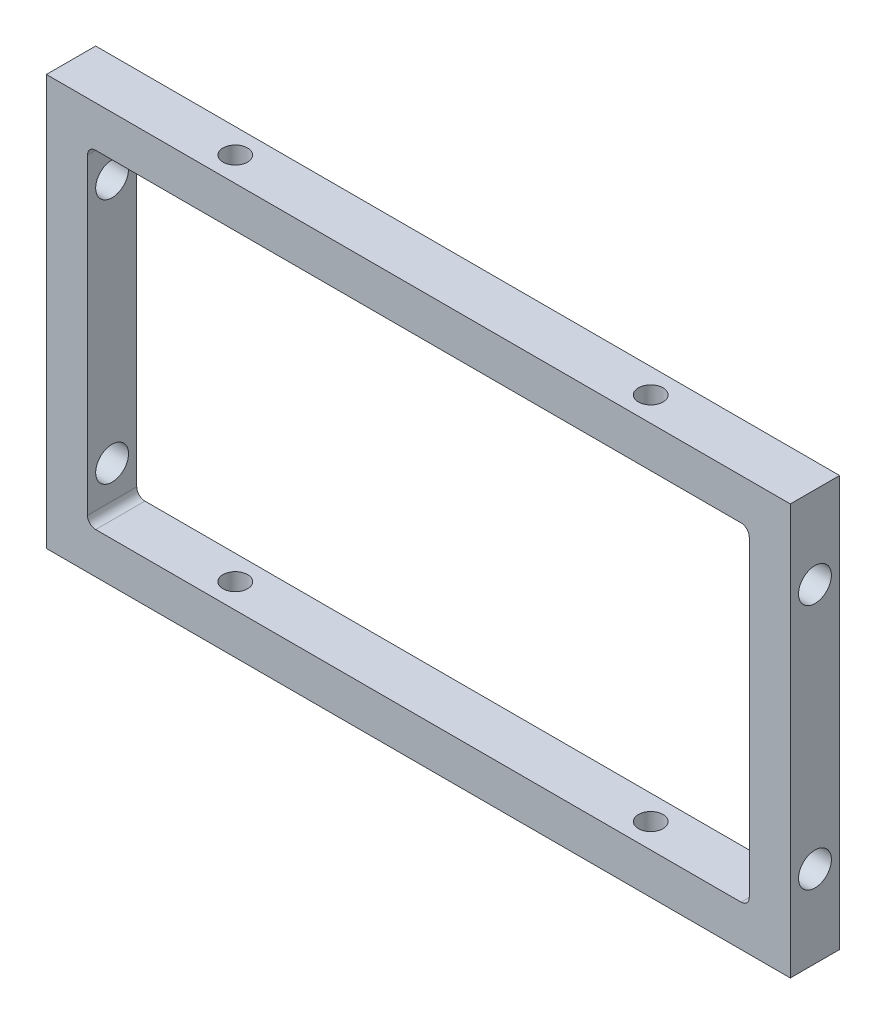
ISO-10303-21;
HEADER;
FILE_DESCRIPTION(('STEP AP214'),'2;1');
FILE_NAME('part.step','',(''),(''),'','','');
FILE_SCHEMA(('AUTOMOTIVE_DESIGN { 1 0 10303 214 1 1 1 1 }'));
ENDSEC;
DATA;
#1=APPLICATION_CONTEXT('core data for automotive mechanical design processes');
#2=APPLICATION_PROTOCOL_DEFINITION('international standard','automotive_design',2000,#1);
#3=PRODUCT_CONTEXT('',#1,'mechanical');
#4=PRODUCT('Part','Part','',(#3));
#5=PRODUCT_RELATED_PRODUCT_CATEGORY('part','',(#4));
#6=PRODUCT_DEFINITION_FORMATION('','',#4);
#7=PRODUCT_DEFINITION_CONTEXT('part definition',#1,'design');
#8=PRODUCT_DEFINITION('design','',#6,#7);
#9=PRODUCT_DEFINITION_SHAPE('','',#8);
#10=(LENGTH_UNIT() NAMED_UNIT(*) SI_UNIT(.MILLI.,.METRE.));
#11=(NAMED_UNIT(*) PLANE_ANGLE_UNIT() SI_UNIT($,.RADIAN.));
#12=(NAMED_UNIT(*) SI_UNIT($,.STERADIAN.) SOLID_ANGLE_UNIT());
#13=UNCERTAINTY_MEASURE_WITH_UNIT(LENGTH_MEASURE(1.E-05),#10,'distance_accuracy_value','');
#14=(GEOMETRIC_REPRESENTATION_CONTEXT(3) GLOBAL_UNCERTAINTY_ASSIGNED_CONTEXT((#13)) GLOBAL_UNIT_ASSIGNED_CONTEXT((#10,
#11,#12)) REPRESENTATION_CONTEXT('',''));
#15=CARTESIAN_POINT('',(0.,0.,0.));
#16=DIRECTION('',(0.,0.,1.));
#17=DIRECTION('',(1.,0.,0.));
#18=AXIS2_PLACEMENT_3D('',#15,#16,#17);
#19=CARTESIAN_POINT('',(0.,0.,6.));
#20=DIRECTION('',(0.,0.,1.));
#21=DIRECTION('',(1.,0.,0.));
#22=AXIS2_PLACEMENT_3D('',#19,#20,#21);
#23=PLANE('',#22);
#24=DIRECTION('',(0.,1.,0.));
#25=VECTOR('',#24,1.);
#26=CARTESIAN_POINT('',(45.3,25.,6.));
#27=LINE('',#26,#25);
#28=CARTESIAN_POINT('',(45.3,-25.,6.));
#29=VERTEX_POINT('',#28);
#30=CARTESIAN_POINT('',(45.3,25.,6.));
#31=VERTEX_POINT('',#30);
#32=EDGE_CURVE('E137',#29,#31,#27,.T.);
#33=ORIENTED_EDGE('',*,*,#32,.T.);
#34=DIRECTION('',(-1.,0.,0.));
#35=VECTOR('',#34,1.);
#36=CARTESIAN_POINT('',(-45.3,25.,6.));
#37=LINE('',#36,#35);
#38=CARTESIAN_POINT('',(-45.3,25.,6.));
#39=VERTEX_POINT('',#38);
#40=EDGE_CURVE('E126',#31,#39,#37,.T.);
#41=ORIENTED_EDGE('',*,*,#40,.T.);
#42=DIRECTION('',(0.,-1.,0.));
#43=VECTOR('',#42,1.);
#44=CARTESIAN_POINT('',(-45.3,25.,6.));
#45=LINE('',#44,#43);
#46=CARTESIAN_POINT('',(-45.3,-25.,6.));
#47=VERTEX_POINT('',#46);
#48=EDGE_CURVE('E136',#39,#47,#45,.T.);
#49=ORIENTED_EDGE('',*,*,#48,.T.);
#50=DIRECTION('',(1.,0.,0.));
#51=VECTOR('',#50,1.);
#52=CARTESIAN_POINT('',(-45.3,-25.,6.));
#53=LINE('',#52,#51);
#54=EDGE_CURVE('E141',#47,#29,#53,.T.);
#55=ORIENTED_EDGE('',*,*,#54,.T.);
#56=EDGE_LOOP('',(#33,#41,#49,#55));
#57=FACE_BOUND('',#56,.T.);
#58=DIRECTION('',(-1.,0.,0.));
#59=VECTOR('',#58,1.);
#60=CARTESIAN_POINT('',(-40.3,20.,6.));
#61=LINE('',#60,#59);
#62=CARTESIAN_POINT('',(39.3,20.,6.));
#63=VERTEX_POINT('',#62);
#64=CARTESIAN_POINT('',(-39.3,20.,6.));
#65=VERTEX_POINT('',#64);
#66=EDGE_CURVE('E237',#63,#65,#61,.T.);
#67=ORIENTED_EDGE('',*,*,#66,.F.);
#68=CARTESIAN_POINT('',(39.3,19.,6.));
#69=DIRECTION('',(0.,0.,1.));
#70=DIRECTION('',(1.,0.,0.));
#71=AXIS2_PLACEMENT_3D('',#68,#69,#70);
#72=CIRCLE('',#71,1.);
#73=CARTESIAN_POINT('',(40.3,19.,6.));
#74=VERTEX_POINT('',#73);
#75=EDGE_CURVE('E51',#63,#74,#72,.F.);
#76=ORIENTED_EDGE('',*,*,#75,.T.);
#77=DIRECTION('',(0.,1.,0.));
#78=VECTOR('',#77,1.);
#79=CARTESIAN_POINT('',(40.3,20.,6.));
#80=LINE('',#79,#78);
#81=CARTESIAN_POINT('',(40.3,-19.,6.));
#82=VERTEX_POINT('',#81);
#83=EDGE_CURVE('E235',#82,#74,#80,.T.);
#84=ORIENTED_EDGE('',*,*,#83,.F.);
#85=CARTESIAN_POINT('',(39.3,-19.,6.));
#86=DIRECTION('',(0.,0.,1.));
#87=DIRECTION('',(1.,0.,0.));
#88=AXIS2_PLACEMENT_3D('',#85,#86,#87);
#89=CIRCLE('',#88,1.);
#90=CARTESIAN_POINT('',(39.3,-20.,6.));
#91=VERTEX_POINT('',#90);
#92=EDGE_CURVE('E11',#82,#91,#89,.F.);
#93=ORIENTED_EDGE('',*,*,#92,.T.);
#94=DIRECTION('',(1.,0.,0.));
#95=VECTOR('',#94,1.);
#96=CARTESIAN_POINT('',(-40.3,-20.,6.));
#97=LINE('',#96,#95);
#98=CARTESIAN_POINT('',(-39.3,-20.,6.));
#99=VERTEX_POINT('',#98);
#100=EDGE_CURVE('E244',#99,#91,#97,.T.);
#101=ORIENTED_EDGE('',*,*,#100,.F.);
#102=CARTESIAN_POINT('',(-39.3,-19.,6.));
#103=DIRECTION('',(0.,0.,1.));
#104=DIRECTION('',(1.,0.,0.));
#105=AXIS2_PLACEMENT_3D('',#102,#103,#104);
#106=CIRCLE('',#105,1.);
#107=CARTESIAN_POINT('',(-40.3,-19.,6.));
#108=VERTEX_POINT('',#107);
#109=EDGE_CURVE('E176',#99,#108,#106,.F.);
#110=ORIENTED_EDGE('',*,*,#109,.T.);
#111=DIRECTION('',(0.,-1.,0.));
#112=VECTOR('',#111,1.);
#113=CARTESIAN_POINT('',(-40.3,20.,6.));
#114=LINE('',#113,#112);
#115=CARTESIAN_POINT('',(-40.3,19.,6.));
#116=VERTEX_POINT('',#115);
#117=EDGE_CURVE('E241',#116,#108,#114,.T.);
#118=ORIENTED_EDGE('',*,*,#117,.F.);
#119=CARTESIAN_POINT('',(-39.3,19.,6.));
#120=DIRECTION('',(0.,0.,1.));
#121=DIRECTION('',(1.,0.,0.));
#122=AXIS2_PLACEMENT_3D('',#119,#120,#121);
#123=CIRCLE('',#122,1.);
#124=EDGE_CURVE('E180',#116,#65,#123,.F.);
#125=ORIENTED_EDGE('',*,*,#124,.T.);
#126=EDGE_LOOP('',(#67,#76,#84,#93,#101,#110,#118,#125));
#127=FACE_BOUND('',#126,.T.);
#128=ADVANCED_FACE('F34',(#57,#127),#23,.T.);
#129=CARTESIAN_POINT('',(0.,0.,0.));
#130=DIRECTION('',(0.,0.,1.));
#131=DIRECTION('',(1.,0.,0.));
#132=AXIS2_PLACEMENT_3D('',#129,#130,#131);
#133=PLANE('',#132);
#134=DIRECTION('',(0.,1.,0.));
#135=VECTOR('',#134,1.);
#136=CARTESIAN_POINT('',(45.3,25.,0.));
#137=LINE('',#136,#135);
#138=CARTESIAN_POINT('',(45.3,-25.,0.));
#139=VERTEX_POINT('',#138);
#140=CARTESIAN_POINT('',(45.3,25.,0.));
#141=VERTEX_POINT('',#140);
#142=EDGE_CURVE('E149',#139,#141,#137,.T.);
#143=ORIENTED_EDGE('',*,*,#142,.F.);
#144=DIRECTION('',(1.,0.,0.));
#145=VECTOR('',#144,1.);
#146=CARTESIAN_POINT('',(-45.3,-25.,0.));
#147=LINE('',#146,#145);
#148=CARTESIAN_POINT('',(-45.3,-25.,0.));
#149=VERTEX_POINT('',#148);
#150=EDGE_CURVE('E145',#149,#139,#147,.T.);
#151=ORIENTED_EDGE('',*,*,#150,.F.);
#152=DIRECTION('',(0.,-1.,0.));
#153=VECTOR('',#152,1.);
#154=CARTESIAN_POINT('',(-45.3,25.,0.));
#155=LINE('',#154,#153);
#156=CARTESIAN_POINT('',(-45.3,25.,0.));
#157=VERTEX_POINT('',#156);
#158=EDGE_CURVE('E263',#157,#149,#155,.T.);
#159=ORIENTED_EDGE('',*,*,#158,.F.);
#160=DIRECTION('',(-1.,0.,0.));
#161=VECTOR('',#160,1.);
#162=CARTESIAN_POINT('',(-45.3,25.,0.));
#163=LINE('',#162,#161);
#164=EDGE_CURVE('E261',#141,#157,#163,.T.);
#165=ORIENTED_EDGE('',*,*,#164,.F.);
#166=EDGE_LOOP('',(#143,#151,#159,#165));
#167=FACE_BOUND('',#166,.T.);
#168=DIRECTION('',(1.,0.,0.));
#169=VECTOR('',#168,1.);
#170=CARTESIAN_POINT('',(-40.3,-20.,0.));
#171=LINE('',#170,#169);
#172=CARTESIAN_POINT('',(-39.3,-20.,0.));
#173=VERTEX_POINT('',#172);
#174=CARTESIAN_POINT('',(39.3,-20.,0.));
#175=VERTEX_POINT('',#174);
#176=EDGE_CURVE('E238',#173,#175,#171,.T.);
#177=ORIENTED_EDGE('',*,*,#176,.T.);
#178=CARTESIAN_POINT('',(39.3,-19.,0.));
#179=DIRECTION('',(0.,0.,1.));
#180=DIRECTION('',(1.,0.,0.));
#181=AXIS2_PLACEMENT_3D('',#178,#179,#180);
#182=CIRCLE('',#181,1.);
#183=CARTESIAN_POINT('',(40.3,-19.,0.));
#184=VERTEX_POINT('',#183);
#185=EDGE_CURVE('E43',#175,#184,#182,.T.);
#186=ORIENTED_EDGE('',*,*,#185,.T.);
#187=DIRECTION('',(0.,1.,0.));
#188=VECTOR('',#187,1.);
#189=CARTESIAN_POINT('',(40.3,20.,0.));
#190=LINE('',#189,#188);
#191=CARTESIAN_POINT('',(40.3,19.,0.));
#192=VERTEX_POINT('',#191);
#193=EDGE_CURVE('E234',#184,#192,#190,.T.);
#194=ORIENTED_EDGE('',*,*,#193,.T.);
#195=CARTESIAN_POINT('',(39.3,19.,0.));
#196=DIRECTION('',(0.,0.,1.));
#197=DIRECTION('',(1.,0.,0.));
#198=AXIS2_PLACEMENT_3D('',#195,#196,#197);
#199=CIRCLE('',#198,1.);
#200=CARTESIAN_POINT('',(39.3,20.,0.));
#201=VERTEX_POINT('',#200);
#202=EDGE_CURVE('E182',#192,#201,#199,.T.);
#203=ORIENTED_EDGE('',*,*,#202,.T.);
#204=DIRECTION('',(-1.,0.,0.));
#205=VECTOR('',#204,1.);
#206=CARTESIAN_POINT('',(-40.3,20.,0.));
#207=LINE('',#206,#205);
#208=CARTESIAN_POINT('',(-39.3,20.,0.));
#209=VERTEX_POINT('',#208);
#210=EDGE_CURVE('E249',#201,#209,#207,.T.);
#211=ORIENTED_EDGE('',*,*,#210,.T.);
#212=CARTESIAN_POINT('',(-39.3,19.,0.));
#213=DIRECTION('',(0.,0.,1.));
#214=DIRECTION('',(1.,0.,0.));
#215=AXIS2_PLACEMENT_3D('',#212,#213,#214);
#216=CIRCLE('',#215,1.);
#217=CARTESIAN_POINT('',(-40.3,19.,0.));
#218=VERTEX_POINT('',#217);
#219=EDGE_CURVE('E178',#209,#218,#216,.T.);
#220=ORIENTED_EDGE('',*,*,#219,.T.);
#221=DIRECTION('',(0.,-1.,0.));
#222=VECTOR('',#221,1.);
#223=CARTESIAN_POINT('',(-40.3,20.,0.));
#224=LINE('',#223,#222);
#225=CARTESIAN_POINT('',(-40.3,-19.,0.));
#226=VERTEX_POINT('',#225);
#227=EDGE_CURVE('E252',#218,#226,#224,.T.);
#228=ORIENTED_EDGE('',*,*,#227,.T.);
#229=CARTESIAN_POINT('',(-39.3,-19.,0.));
#230=DIRECTION('',(0.,0.,1.));
#231=DIRECTION('',(1.,0.,0.));
#232=AXIS2_PLACEMENT_3D('',#229,#230,#231);
#233=CIRCLE('',#232,1.);
#234=EDGE_CURVE('E174',#226,#173,#233,.T.);
#235=ORIENTED_EDGE('',*,*,#234,.T.);
#236=EDGE_LOOP('',(#177,#186,#194,#203,#211,#220,#228,#235));
#237=FACE_BOUND('',#236,.T.);
#238=ADVANCED_FACE('F274',(#167,#237),#133,.F.);
#239=CARTESIAN_POINT('',(45.3,25.,6.));
#240=DIRECTION('',(-1.,0.,0.));
#241=DIRECTION('',(0.,0.,1.));
#242=AXIS2_PLACEMENT_3D('',#239,#240,#241);
#243=PLANE('',#242);
#244=CARTESIAN_POINT('',(45.3,15.,3.));
#245=DIRECTION('',(1.,0.,0.));
#246=DIRECTION('',(0.,0.,-1.));
#247=AXIS2_PLACEMENT_3D('',#244,#245,#246);
#248=CIRCLE('',#247,2.);
#249=CARTESIAN_POINT('',(45.3,15.,1.));
#250=VERTEX_POINT('',#249);
#251=EDGE_CURVE('E222',#250,#250,#248,.T.);
#252=ORIENTED_EDGE('',*,*,#251,.F.);
#253=EDGE_LOOP('',(#252));
#254=FACE_BOUND('',#253,.T.);
#255=CARTESIAN_POINT('',(45.3,-15.,3.));
#256=DIRECTION('',(1.,0.,0.));
#257=DIRECTION('',(0.,0.,-1.));
#258=AXIS2_PLACEMENT_3D('',#255,#256,#257);
#259=CIRCLE('',#258,2.);
#260=CARTESIAN_POINT('',(45.3,-15.,1.));
#261=VERTEX_POINT('',#260);
#262=EDGE_CURVE('E219',#261,#261,#259,.T.);
#263=ORIENTED_EDGE('',*,*,#262,.F.);
#264=EDGE_LOOP('',(#263));
#265=FACE_BOUND('',#264,.T.);
#266=ORIENTED_EDGE('',*,*,#142,.T.);
#267=DIRECTION('',(0.,0.,-1.));
#268=VECTOR('',#267,1.);
#269=CARTESIAN_POINT('',(45.3,25.,6.));
#270=LINE('',#269,#268);
#271=EDGE_CURVE('E130',#31,#141,#270,.T.);
#272=ORIENTED_EDGE('',*,*,#271,.F.);
#273=ORIENTED_EDGE('',*,*,#32,.F.);
#274=DIRECTION('',(0.,0.,-1.));
#275=VECTOR('',#274,1.);
#276=CARTESIAN_POINT('',(45.3,-25.,6.));
#277=LINE('',#276,#275);
#278=EDGE_CURVE('E259',#29,#139,#277,.T.);
#279=ORIENTED_EDGE('',*,*,#278,.T.);
#280=EDGE_LOOP('',(#266,#272,#273,#279));
#281=FACE_BOUND('',#280,.T.);
#282=ADVANCED_FACE('F147',(#254,#265,#281),#243,.F.);
#283=CARTESIAN_POINT('',(-45.3,25.,6.));
#284=DIRECTION('',(0.,-1.,0.));
#285=DIRECTION('',(0.,0.,-1.));
#286=AXIS2_PLACEMENT_3D('',#283,#284,#285);
#287=PLANE('',#286);
#288=CARTESIAN_POINT('',(-25.3,25.,3.));
#289=DIRECTION('',(0.,1.,0.));
#290=DIRECTION('',(0.,0.,1.));
#291=AXIS2_PLACEMENT_3D('',#288,#289,#290);
#292=CIRCLE('',#291,1.5);
#293=CARTESIAN_POINT('',(-25.3,25.,4.5));
#294=VERTEX_POINT('',#293);
#295=EDGE_CURVE('E203',#294,#294,#292,.T.);
#296=ORIENTED_EDGE('',*,*,#295,.F.);
#297=EDGE_LOOP('',(#296));
#298=FACE_BOUND('',#297,.T.);
#299=CARTESIAN_POINT('',(25.3,25.,2.99999999999999));
#300=DIRECTION('',(0.,1.,0.));
#301=DIRECTION('',(0.,0.,1.));
#302=AXIS2_PLACEMENT_3D('',#299,#300,#301);
#303=CIRCLE('',#302,1.5);
#304=CARTESIAN_POINT('',(25.3,25.,4.49999999999999));
#305=VERTEX_POINT('',#304);
#306=EDGE_CURVE('E213',#305,#305,#303,.T.);
#307=ORIENTED_EDGE('',*,*,#306,.F.);
#308=EDGE_LOOP('',(#307));
#309=FACE_BOUND('',#308,.T.);
#310=ORIENTED_EDGE('',*,*,#164,.T.);
#311=DIRECTION('',(0.,0.,-1.));
#312=VECTOR('',#311,1.);
#313=CARTESIAN_POINT('',(-45.3,25.,6.));
#314=LINE('',#313,#312);
#315=EDGE_CURVE('E133',#39,#157,#314,.T.);
#316=ORIENTED_EDGE('',*,*,#315,.F.);
#317=ORIENTED_EDGE('',*,*,#40,.F.);
#318=ORIENTED_EDGE('',*,*,#271,.T.);
#319=EDGE_LOOP('',(#310,#316,#317,#318));
#320=FACE_BOUND('',#319,.T.);
#321=ADVANCED_FACE('F128',(#298,#309,#320),#287,.F.);
#322=CARTESIAN_POINT('',(-45.3,25.,6.));
#323=DIRECTION('',(1.,0.,0.));
#324=DIRECTION('',(0.,0.,-1.));
#325=AXIS2_PLACEMENT_3D('',#322,#323,#324);
#326=PLANE('',#325);
#327=CARTESIAN_POINT('',(-45.3,15.,3.));
#328=DIRECTION('',(1.,0.,0.));
#329=DIRECTION('',(0.,0.,-1.));
#330=AXIS2_PLACEMENT_3D('',#327,#328,#329);
#331=CIRCLE('',#330,2.);
#332=CARTESIAN_POINT('',(-45.3,15.,1.));
#333=VERTEX_POINT('',#332);
#334=EDGE_CURVE('E190',#333,#333,#331,.T.);
#335=ORIENTED_EDGE('',*,*,#334,.T.);
#336=EDGE_LOOP('',(#335));
#337=FACE_BOUND('',#336,.T.);
#338=CARTESIAN_POINT('',(-45.3,-15.,3.));
#339=DIRECTION('',(1.,0.,0.));
#340=DIRECTION('',(0.,0.,-1.));
#341=AXIS2_PLACEMENT_3D('',#338,#339,#340);
#342=CIRCLE('',#341,2.);
#343=CARTESIAN_POINT('',(-45.3,-15.,1.));
#344=VERTEX_POINT('',#343);
#345=EDGE_CURVE('E225',#344,#344,#342,.T.);
#346=ORIENTED_EDGE('',*,*,#345,.T.);
#347=EDGE_LOOP('',(#346));
#348=FACE_BOUND('',#347,.T.);
#349=ORIENTED_EDGE('',*,*,#158,.T.);
#350=DIRECTION('',(0.,0.,-1.));
#351=VECTOR('',#350,1.);
#352=CARTESIAN_POINT('',(-45.3,-25.,6.));
#353=LINE('',#352,#351);
#354=EDGE_CURVE('E154',#47,#149,#353,.T.);
#355=ORIENTED_EDGE('',*,*,#354,.F.);
#356=ORIENTED_EDGE('',*,*,#48,.F.);
#357=ORIENTED_EDGE('',*,*,#315,.T.);
#358=EDGE_LOOP('',(#349,#355,#356,#357));
#359=FACE_BOUND('',#358,.T.);
#360=ADVANCED_FACE('F276',(#337,#348,#359),#326,.F.);
#361=CARTESIAN_POINT('',(-45.3,-25.,6.));
#362=DIRECTION('',(0.,1.,0.));
#363=DIRECTION('',(0.,0.,1.));
#364=AXIS2_PLACEMENT_3D('',#361,#362,#363);
#365=PLANE('',#364);
#366=CARTESIAN_POINT('',(-25.3,-25.,3.));
#367=DIRECTION('',(0.,1.,0.));
#368=DIRECTION('',(0.,0.,1.));
#369=AXIS2_PLACEMENT_3D('',#366,#367,#368);
#370=CIRCLE('',#369,1.5);
#371=CARTESIAN_POINT('',(-25.3,-25.,4.5));
#372=VERTEX_POINT('',#371);
#373=EDGE_CURVE('E197',#372,#372,#370,.T.);
#374=ORIENTED_EDGE('',*,*,#373,.T.);
#375=EDGE_LOOP('',(#374));
#376=FACE_BOUND('',#375,.T.);
#377=CARTESIAN_POINT('',(25.3,-25.,2.99999999999999));
#378=DIRECTION('',(0.,1.,0.));
#379=DIRECTION('',(0.,0.,1.));
#380=AXIS2_PLACEMENT_3D('',#377,#378,#379);
#381=CIRCLE('',#380,1.5);
#382=CARTESIAN_POINT('',(25.3,-25.,4.49999999999999));
#383=VERTEX_POINT('',#382);
#384=EDGE_CURVE('E208',#383,#383,#381,.T.);
#385=ORIENTED_EDGE('',*,*,#384,.T.);
#386=EDGE_LOOP('',(#385));
#387=FACE_BOUND('',#386,.T.);
#388=ORIENTED_EDGE('',*,*,#150,.T.);
#389=ORIENTED_EDGE('',*,*,#278,.F.);
#390=ORIENTED_EDGE('',*,*,#54,.F.);
#391=ORIENTED_EDGE('',*,*,#354,.T.);
#392=EDGE_LOOP('',(#388,#389,#390,#391));
#393=FACE_BOUND('',#392,.T.);
#394=ADVANCED_FACE('F270',(#376,#387,#393),#365,.F.);
#395=CARTESIAN_POINT('',(40.3,20.,6.));
#396=DIRECTION('',(-1.,0.,0.));
#397=DIRECTION('',(0.,0.,1.));
#398=AXIS2_PLACEMENT_3D('',#395,#396,#397);
#399=PLANE('',#398);
#400=CARTESIAN_POINT('',(40.3,15.,3.));
#401=DIRECTION('',(-1.,0.,0.));
#402=DIRECTION('',(0.,0.,1.));
#403=AXIS2_PLACEMENT_3D('',#400,#401,#402);
#404=CIRCLE('',#403,2.);
#405=CARTESIAN_POINT('',(40.3,15.,5.));
#406=VERTEX_POINT('',#405);
#407=EDGE_CURVE('E193',#406,#406,#404,.T.);
#408=ORIENTED_EDGE('',*,*,#407,.F.);
#409=EDGE_LOOP('',(#408));
#410=FACE_BOUND('',#409,.T.);
#411=CARTESIAN_POINT('',(40.3,-15.,3.));
#412=DIRECTION('',(-1.,0.,0.));
#413=DIRECTION('',(0.,0.,1.));
#414=AXIS2_PLACEMENT_3D('',#411,#412,#413);
#415=CIRCLE('',#414,2.);
#416=CARTESIAN_POINT('',(40.3,-15.,5.));
#417=VERTEX_POINT('',#416);
#418=EDGE_CURVE('E189',#417,#417,#415,.T.);
#419=ORIENTED_EDGE('',*,*,#418,.F.);
#420=EDGE_LOOP('',(#419));
#421=FACE_BOUND('',#420,.T.);
#422=ORIENTED_EDGE('',*,*,#83,.T.);
#423=DIRECTION('',(0.,0.,-1.));
#424=VECTOR('',#423,1.);
#425=CARTESIAN_POINT('',(40.3,19.,0.));
#426=LINE('',#425,#424);
#427=EDGE_CURVE('E171',#74,#192,#426,.T.);
#428=ORIENTED_EDGE('',*,*,#427,.T.);
#429=ORIENTED_EDGE('',*,*,#193,.F.);
#430=DIRECTION('',(0.,0.,-1.));
#431=VECTOR('',#430,1.);
#432=CARTESIAN_POINT('',(40.3,-19.,6.));
#433=LINE('',#432,#431);
#434=EDGE_CURVE('E58',#184,#82,#433,.F.);
#435=ORIENTED_EDGE('',*,*,#434,.T.);
#436=EDGE_LOOP('',(#422,#428,#429,#435));
#437=FACE_BOUND('',#436,.T.);
#438=ADVANCED_FACE('F284',(#410,#421,#437),#399,.T.);
#439=CARTESIAN_POINT('',(-40.3,20.,6.));
#440=DIRECTION('',(0.,-1.,0.));
#441=DIRECTION('',(0.,0.,-1.));
#442=AXIS2_PLACEMENT_3D('',#439,#440,#441);
#443=PLANE('',#442);
#444=CARTESIAN_POINT('',(-25.3,20.,3.));
#445=DIRECTION('',(0.,-1.,0.));
#446=DIRECTION('',(0.,0.,-1.));
#447=AXIS2_PLACEMENT_3D('',#444,#445,#446);
#448=CIRCLE('',#447,1.5);
#449=CARTESIAN_POINT('',(-25.3,20.,1.5));
#450=VERTEX_POINT('',#449);
#451=EDGE_CURVE('E216',#450,#450,#448,.T.);
#452=ORIENTED_EDGE('',*,*,#451,.F.);
#453=EDGE_LOOP('',(#452));
#454=FACE_BOUND('',#453,.T.);
#455=CARTESIAN_POINT('',(25.3,20.,2.99999999999999));
#456=DIRECTION('',(0.,-1.,0.));
#457=DIRECTION('',(0.,0.,-1.));
#458=AXIS2_PLACEMENT_3D('',#455,#456,#457);
#459=CIRCLE('',#458,1.5);
#460=CARTESIAN_POINT('',(25.3,20.,1.49999999999999));
#461=VERTEX_POINT('',#460);
#462=EDGE_CURVE('E196',#461,#461,#459,.T.);
#463=ORIENTED_EDGE('',*,*,#462,.F.);
#464=EDGE_LOOP('',(#463));
#465=FACE_BOUND('',#464,.T.);
#466=ORIENTED_EDGE('',*,*,#66,.T.);
#467=DIRECTION('',(0.,0.,-1.));
#468=VECTOR('',#467,1.);
#469=CARTESIAN_POINT('',(-39.3,20.,0.));
#470=LINE('',#469,#468);
#471=EDGE_CURVE('E167',#65,#209,#470,.T.);
#472=ORIENTED_EDGE('',*,*,#471,.T.);
#473=ORIENTED_EDGE('',*,*,#210,.F.);
#474=DIRECTION('',(0.,0.,-1.));
#475=VECTOR('',#474,1.);
#476=CARTESIAN_POINT('',(39.3,20.,6.));
#477=LINE('',#476,#475);
#478=EDGE_CURVE('E165',#201,#63,#477,.F.);
#479=ORIENTED_EDGE('',*,*,#478,.T.);
#480=EDGE_LOOP('',(#466,#472,#473,#479));
#481=FACE_BOUND('',#480,.T.);
#482=ADVANCED_FACE('F298',(#454,#465,#481),#443,.T.);
#483=CARTESIAN_POINT('',(-40.3,20.,6.));
#484=DIRECTION('',(1.,0.,0.));
#485=DIRECTION('',(0.,0.,-1.));
#486=AXIS2_PLACEMENT_3D('',#483,#484,#485);
#487=PLANE('',#486);
#488=CARTESIAN_POINT('',(-40.3,15.,3.));
#489=DIRECTION('',(1.,0.,0.));
#490=DIRECTION('',(0.,0.,-1.));
#491=AXIS2_PLACEMENT_3D('',#488,#489,#490);
#492=CIRCLE('',#491,2.);
#493=CARTESIAN_POINT('',(-40.3,15.,1.));
#494=VERTEX_POINT('',#493);
#495=EDGE_CURVE('E191',#494,#494,#492,.T.);
#496=ORIENTED_EDGE('',*,*,#495,.F.);
#497=EDGE_LOOP('',(#496));
#498=FACE_BOUND('',#497,.T.);
#499=CARTESIAN_POINT('',(-40.3,-15.,3.));
#500=DIRECTION('',(1.,0.,0.));
#501=DIRECTION('',(0.,0.,-1.));
#502=AXIS2_PLACEMENT_3D('',#499,#500,#501);
#503=CIRCLE('',#502,2.);
#504=CARTESIAN_POINT('',(-40.3,-15.,1.));
#505=VERTEX_POINT('',#504);
#506=EDGE_CURVE('E186',#505,#505,#503,.T.);
#507=ORIENTED_EDGE('',*,*,#506,.F.);
#508=EDGE_LOOP('',(#507));
#509=FACE_BOUND('',#508,.T.);
#510=ORIENTED_EDGE('',*,*,#117,.T.);
#511=DIRECTION('',(0.,0.,-1.));
#512=VECTOR('',#511,1.);
#513=CARTESIAN_POINT('',(-40.3,-19.,0.));
#514=LINE('',#513,#512);
#515=EDGE_CURVE('E152',#108,#226,#514,.T.);
#516=ORIENTED_EDGE('',*,*,#515,.T.);
#517=ORIENTED_EDGE('',*,*,#227,.F.);
#518=DIRECTION('',(0.,0.,-1.));
#519=VECTOR('',#518,1.);
#520=CARTESIAN_POINT('',(-40.3,19.,6.));
#521=LINE('',#520,#519);
#522=EDGE_CURVE('E150',#218,#116,#521,.F.);
#523=ORIENTED_EDGE('',*,*,#522,.T.);
#524=EDGE_LOOP('',(#510,#516,#517,#523));
#525=FACE_BOUND('',#524,.T.);
#526=ADVANCED_FACE('F302',(#498,#509,#525),#487,.T.);
#527=CARTESIAN_POINT('',(-40.3,-20.,6.));
#528=DIRECTION('',(0.,1.,0.));
#529=DIRECTION('',(0.,0.,1.));
#530=AXIS2_PLACEMENT_3D('',#527,#528,#529);
#531=PLANE('',#530);
#532=CARTESIAN_POINT('',(-25.3,-20.,3.));
#533=DIRECTION('',(0.,1.,0.));
#534=DIRECTION('',(0.,0.,1.));
#535=AXIS2_PLACEMENT_3D('',#532,#533,#534);
#536=CIRCLE('',#535,1.5);
#537=CARTESIAN_POINT('',(-25.3,-20.,4.5));
#538=VERTEX_POINT('',#537);
#539=EDGE_CURVE('E38',#538,#538,#536,.T.);
#540=ORIENTED_EDGE('',*,*,#539,.F.);
#541=EDGE_LOOP('',(#540));
#542=FACE_BOUND('',#541,.T.);
#543=CARTESIAN_POINT('',(25.3,-20.,2.99999999999999));
#544=DIRECTION('',(0.,1.,0.));
#545=DIRECTION('',(0.,0.,1.));
#546=AXIS2_PLACEMENT_3D('',#543,#544,#545);
#547=CIRCLE('',#546,1.5);
#548=CARTESIAN_POINT('',(25.3,-20.,4.49999999999999));
#549=VERTEX_POINT('',#548);
#550=EDGE_CURVE('E194',#549,#549,#547,.T.);
#551=ORIENTED_EDGE('',*,*,#550,.F.);
#552=EDGE_LOOP('',(#551));
#553=FACE_BOUND('',#552,.T.);
#554=ORIENTED_EDGE('',*,*,#176,.F.);
#555=DIRECTION('',(0.,0.,-1.));
#556=VECTOR('',#555,1.);
#557=CARTESIAN_POINT('',(-39.3,-20.,6.));
#558=LINE('',#557,#556);
#559=EDGE_CURVE('E163',#173,#99,#558,.F.);
#560=ORIENTED_EDGE('',*,*,#559,.T.);
#561=ORIENTED_EDGE('',*,*,#100,.T.);
#562=DIRECTION('',(0.,0.,-1.));
#563=VECTOR('',#562,1.);
#564=CARTESIAN_POINT('',(39.3,-20.,0.));
#565=LINE('',#564,#563);
#566=EDGE_CURVE('E160',#91,#175,#565,.T.);
#567=ORIENTED_EDGE('',*,*,#566,.T.);
#568=EDGE_LOOP('',(#554,#560,#561,#567));
#569=FACE_BOUND('',#568,.T.);
#570=ADVANCED_FACE('F306',(#542,#553,#569),#531,.T.);
#571=CARTESIAN_POINT('',(-39.3,-19.,6.));
#572=DIRECTION('',(0.,0.,1.));
#573=DIRECTION('',(1.,0.,0.));
#574=AXIS2_PLACEMENT_3D('',#571,#572,#573);
#575=CYLINDRICAL_SURFACE('',#574,1.);
#576=ORIENTED_EDGE('',*,*,#109,.F.);
#577=ORIENTED_EDGE('',*,*,#559,.F.);
#578=ORIENTED_EDGE('',*,*,#234,.F.);
#579=ORIENTED_EDGE('',*,*,#515,.F.);
#580=EDGE_LOOP('',(#576,#577,#578,#579));
#581=FACE_BOUND('',#580,.T.);
#582=ADVANCED_FACE('F310',(#581),#575,.F.);
#583=CARTESIAN_POINT('',(-39.3,19.,6.));
#584=DIRECTION('',(0.,0.,1.));
#585=DIRECTION('',(1.,0.,0.));
#586=AXIS2_PLACEMENT_3D('',#583,#584,#585);
#587=CYLINDRICAL_SURFACE('',#586,1.);
#588=ORIENTED_EDGE('',*,*,#124,.F.);
#589=ORIENTED_EDGE('',*,*,#522,.F.);
#590=ORIENTED_EDGE('',*,*,#219,.F.);
#591=ORIENTED_EDGE('',*,*,#471,.F.);
#592=EDGE_LOOP('',(#588,#589,#590,#591));
#593=FACE_BOUND('',#592,.T.);
#594=ADVANCED_FACE('F354',(#593),#587,.F.);
#595=CARTESIAN_POINT('',(39.3,19.,6.));
#596=DIRECTION('',(0.,0.,1.));
#597=DIRECTION('',(1.,0.,0.));
#598=AXIS2_PLACEMENT_3D('',#595,#596,#597);
#599=CYLINDRICAL_SURFACE('',#598,1.);
#600=ORIENTED_EDGE('',*,*,#75,.F.);
#601=ORIENTED_EDGE('',*,*,#478,.F.);
#602=ORIENTED_EDGE('',*,*,#202,.F.);
#603=ORIENTED_EDGE('',*,*,#427,.F.);
#604=EDGE_LOOP('',(#600,#601,#602,#603));
#605=FACE_BOUND('',#604,.T.);
#606=ADVANCED_FACE('F371',(#605),#599,.F.);
#607=CARTESIAN_POINT('',(39.3,-19.,6.));
#608=DIRECTION('',(0.,0.,1.));
#609=DIRECTION('',(1.,0.,0.));
#610=AXIS2_PLACEMENT_3D('',#607,#608,#609);
#611=CYLINDRICAL_SURFACE('',#610,1.);
#612=ORIENTED_EDGE('',*,*,#92,.F.);
#613=ORIENTED_EDGE('',*,*,#434,.F.);
#614=ORIENTED_EDGE('',*,*,#185,.F.);
#615=ORIENTED_EDGE('',*,*,#566,.F.);
#616=EDGE_LOOP('',(#612,#613,#614,#615));
#617=FACE_BOUND('',#616,.T.);
#618=ADVANCED_FACE('F36',(#617),#611,.F.);
#619=CARTESIAN_POINT('',(-45.3,-15.,3.));
#620=DIRECTION('',(1.,0.,0.));
#621=DIRECTION('',(0.,0.,-1.));
#622=AXIS2_PLACEMENT_3D('',#619,#620,#621);
#623=CYLINDRICAL_SURFACE('',#622,2.);
#624=ORIENTED_EDGE('',*,*,#506,.T.);
#625=EDGE_LOOP('',(#624));
#626=FACE_BOUND('',#625,.T.);
#627=ORIENTED_EDGE('',*,*,#345,.F.);
#628=EDGE_LOOP('',(#627));
#629=FACE_BOUND('',#628,.T.);
#630=ADVANCED_FACE('F312',(#626,#629),#623,.F.);
#631=CARTESIAN_POINT('',(-45.3,15.,3.));
#632=DIRECTION('',(1.,0.,0.));
#633=DIRECTION('',(0.,0.,-1.));
#634=AXIS2_PLACEMENT_3D('',#631,#632,#633);
#635=CYLINDRICAL_SURFACE('',#634,2.);
#636=ORIENTED_EDGE('',*,*,#495,.T.);
#637=EDGE_LOOP('',(#636));
#638=FACE_BOUND('',#637,.T.);
#639=ORIENTED_EDGE('',*,*,#334,.F.);
#640=EDGE_LOOP('',(#639));
#641=FACE_BOUND('',#640,.T.);
#642=ADVANCED_FACE('F315',(#638,#641),#635,.F.);
#643=ORIENTED_EDGE('',*,*,#418,.T.);
#644=EDGE_LOOP('',(#643));
#645=FACE_BOUND('',#644,.T.);
#646=ORIENTED_EDGE('',*,*,#262,.T.);
#647=EDGE_LOOP('',(#646));
#648=FACE_BOUND('',#647,.T.);
#649=ADVANCED_FACE('F317',(#645,#648),#623,.F.);
#650=ORIENTED_EDGE('',*,*,#407,.T.);
#651=EDGE_LOOP('',(#650));
#652=FACE_BOUND('',#651,.T.);
#653=ORIENTED_EDGE('',*,*,#251,.T.);
#654=EDGE_LOOP('',(#653));
#655=FACE_BOUND('',#654,.T.);
#656=ADVANCED_FACE('F321',(#652,#655),#635,.F.);
#657=CARTESIAN_POINT('',(25.3,-25.,2.99999999999999));
#658=DIRECTION('',(0.,1.,0.));
#659=DIRECTION('',(0.,0.,1.));
#660=AXIS2_PLACEMENT_3D('',#657,#658,#659);
#661=CYLINDRICAL_SURFACE('',#660,1.5);
#662=ORIENTED_EDGE('',*,*,#550,.T.);
#663=EDGE_LOOP('',(#662));
#664=FACE_BOUND('',#663,.T.);
#665=ORIENTED_EDGE('',*,*,#384,.F.);
#666=EDGE_LOOP('',(#665));
#667=FACE_BOUND('',#666,.T.);
#668=ADVANCED_FACE('F322',(#664,#667),#661,.F.);
#669=CARTESIAN_POINT('',(-25.3,-25.,3.));
#670=DIRECTION('',(0.,1.,0.));
#671=DIRECTION('',(0.,0.,1.));
#672=AXIS2_PLACEMENT_3D('',#669,#670,#671);
#673=CYLINDRICAL_SURFACE('',#672,1.5);
#674=ORIENTED_EDGE('',*,*,#539,.T.);
#675=EDGE_LOOP('',(#674));
#676=FACE_BOUND('',#675,.T.);
#677=ORIENTED_EDGE('',*,*,#373,.F.);
#678=EDGE_LOOP('',(#677));
#679=FACE_BOUND('',#678,.T.);
#680=ADVANCED_FACE('F325',(#676,#679),#673,.F.);
#681=ORIENTED_EDGE('',*,*,#462,.T.);
#682=EDGE_LOOP('',(#681));
#683=FACE_BOUND('',#682,.T.);
#684=ORIENTED_EDGE('',*,*,#306,.T.);
#685=EDGE_LOOP('',(#684));
#686=FACE_BOUND('',#685,.T.);
#687=ADVANCED_FACE('F326',(#683,#686),#661,.F.);
#688=ORIENTED_EDGE('',*,*,#451,.T.);
#689=EDGE_LOOP('',(#688));
#690=FACE_BOUND('',#689,.T.);
#691=ORIENTED_EDGE('',*,*,#295,.T.);
#692=EDGE_LOOP('',(#691));
#693=FACE_BOUND('',#692,.T.);
#694=ADVANCED_FACE('F329',(#690,#693),#673,.F.);
#695=CLOSED_SHELL('',(#128,#238,#282,#321,#360,#394,#438,#482,#526,#570,#582,#594,#606,#618,
#630,#642,#649,#656,#668,#680,#687,#694));
#696=MANIFOLD_SOLID_BREP('B2',#695);
#697=ADVANCED_BREP_SHAPE_REPRESENTATION('',(#18,#696),#14);
#698=SHAPE_DEFINITION_REPRESENTATION(#9,#697);
ENDSEC;
END-ISO-10303-21;
